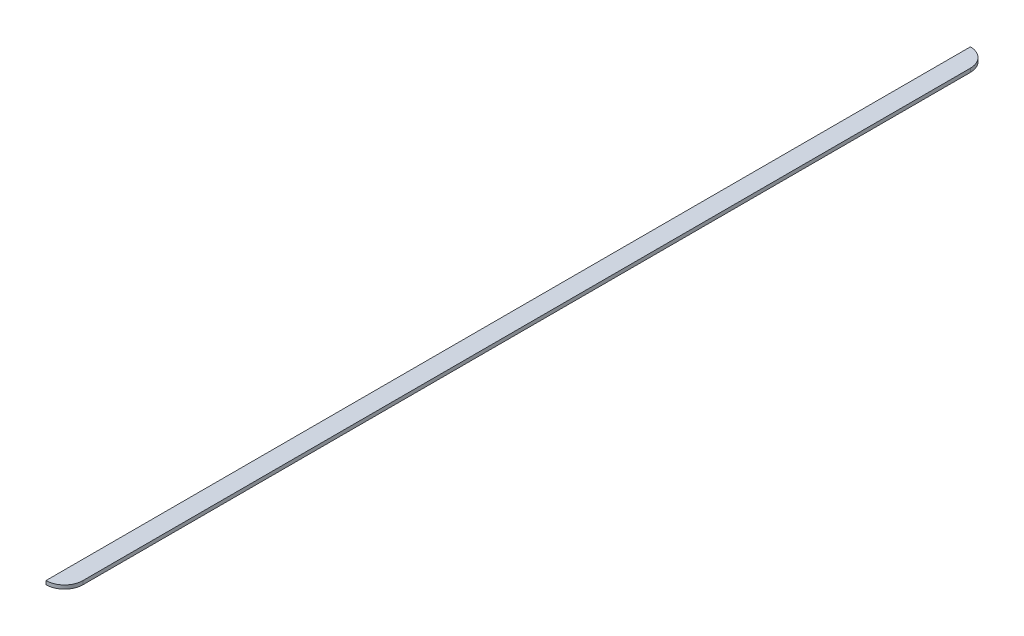
ISO-10303-21;
HEADER;
FILE_DESCRIPTION(('STEP AP214'),'2;1');
FILE_NAME('part.step','',(''),(''),'','','');
FILE_SCHEMA(('AUTOMOTIVE_DESIGN { 1 0 10303 214 1 1 1 1 }'));
ENDSEC;
DATA;
#1=APPLICATION_CONTEXT('core data for automotive mechanical design processes');
#2=APPLICATION_PROTOCOL_DEFINITION('international standard','automotive_design',2000,#1);
#3=PRODUCT_CONTEXT('',#1,'mechanical');
#4=PRODUCT('Part','Part','',(#3));
#5=PRODUCT_RELATED_PRODUCT_CATEGORY('part','',(#4));
#6=PRODUCT_DEFINITION_FORMATION('','',#4);
#7=PRODUCT_DEFINITION_CONTEXT('part definition',#1,'design');
#8=PRODUCT_DEFINITION('design','',#6,#7);
#9=PRODUCT_DEFINITION_SHAPE('','',#8);
#10=(LENGTH_UNIT() NAMED_UNIT(*) SI_UNIT(.MILLI.,.METRE.));
#11=(NAMED_UNIT(*) PLANE_ANGLE_UNIT() SI_UNIT($,.RADIAN.));
#12=(NAMED_UNIT(*) SI_UNIT($,.STERADIAN.) SOLID_ANGLE_UNIT());
#13=UNCERTAINTY_MEASURE_WITH_UNIT(LENGTH_MEASURE(1.E-05),#10,'distance_accuracy_value','');
#14=(GEOMETRIC_REPRESENTATION_CONTEXT(3) GLOBAL_UNCERTAINTY_ASSIGNED_CONTEXT((#13)) GLOBAL_UNIT_ASSIGNED_CONTEXT((#10,
#11,#12)) REPRESENTATION_CONTEXT('',''));
#15=CARTESIAN_POINT('',(0.,0.,0.));
#16=DIRECTION('',(0.,0.,1.));
#17=DIRECTION('',(1.,0.,0.));
#18=AXIS2_PLACEMENT_3D('',#15,#16,#17);
#19=CARTESIAN_POINT('',(0.,0.,250.));
#20=DIRECTION('',(-1.,0.,0.));
#21=DIRECTION('',(0.,-1.,0.));
#22=AXIS2_PLACEMENT_3D('',#19,#20,#21);
#23=PLANE('',#22);
#24=DIRECTION('',(0.,1.,0.));
#25=VECTOR('',#24,1.);
#26=CARTESIAN_POINT('',(0.,0.,-250.));
#27=LINE('',#26,#25);
#28=CARTESIAN_POINT('',(0.,0.,-250.));
#29=VERTEX_POINT('',#28);
#30=CARTESIAN_POINT('',(0.,2.,-250.));
#31=VERTEX_POINT('',#30);
#32=EDGE_CURVE('E96',#29,#31,#27,.T.);
#33=ORIENTED_EDGE('',*,*,#32,.F.);
#34=DIRECTION('',(0.,0.,-1.));
#35=VECTOR('',#34,1.);
#36=CARTESIAN_POINT('',(0.,0.,250.));
#37=LINE('',#36,#35);
#38=CARTESIAN_POINT('',(0.,0.,250.));
#39=VERTEX_POINT('',#38);
#40=EDGE_CURVE('E95',#39,#29,#37,.T.);
#41=ORIENTED_EDGE('',*,*,#40,.F.);
#42=DIRECTION('',(0.,1.,0.));
#43=VECTOR('',#42,1.);
#44=CARTESIAN_POINT('',(0.,0.,250.));
#45=LINE('',#44,#43);
#46=CARTESIAN_POINT('',(0.,2.,250.));
#47=VERTEX_POINT('',#46);
#48=EDGE_CURVE('E80',#39,#47,#45,.T.);
#49=ORIENTED_EDGE('',*,*,#48,.T.);
#50=DIRECTION('',(0.,0.,-1.));
#51=VECTOR('',#50,1.);
#52=CARTESIAN_POINT('',(0.,2.,250.));
#53=LINE('',#52,#51);
#54=EDGE_CURVE('E87',#47,#31,#53,.T.);
#55=ORIENTED_EDGE('',*,*,#54,.T.);
#56=EDGE_LOOP('',(#33,#41,#49,#55));
#57=FACE_BOUND('',#56,.T.);
#58=ADVANCED_FACE('F37',(#57),#23,.T.);
#59=CARTESIAN_POINT('',(0.,0.,250.));
#60=DIRECTION('',(0.,1.,0.));
#61=DIRECTION('',(0.,0.,1.));
#62=AXIS2_PLACEMENT_3D('',#59,#60,#61);
#63=PLANE('',#62);
#64=ORIENTED_EDGE('',*,*,#40,.T.);
#65=CARTESIAN_POINT('',(0.,0.,-240.));
#66=DIRECTION('',(0.,1.,0.));
#67=DIRECTION('',(0.,0.,1.));
#68=AXIS2_PLACEMENT_3D('',#65,#66,#67);
#69=CIRCLE('',#68,10.);
#70=CARTESIAN_POINT('',(10.,0.,-240.));
#71=VERTEX_POINT('',#70);
#72=EDGE_CURVE('E11',#29,#71,#69,.F.);
#73=ORIENTED_EDGE('',*,*,#72,.T.);
#74=DIRECTION('',(0.,0.,-1.));
#75=VECTOR('',#74,1.);
#76=CARTESIAN_POINT('',(10.,0.,250.));
#77=LINE('',#76,#75);
#78=CARTESIAN_POINT('',(10.,0.,240.));
#79=VERTEX_POINT('',#78);
#80=EDGE_CURVE('E101',#79,#71,#77,.T.);
#81=ORIENTED_EDGE('',*,*,#80,.F.);
#82=CARTESIAN_POINT('',(0.,0.,240.));
#83=DIRECTION('',(0.,1.,0.));
#84=DIRECTION('',(0.,0.,1.));
#85=AXIS2_PLACEMENT_3D('',#82,#83,#84);
#86=CIRCLE('',#85,10.);
#87=EDGE_CURVE('E45',#79,#39,#86,.F.);
#88=ORIENTED_EDGE('',*,*,#87,.T.);
#89=EDGE_LOOP('',(#64,#73,#81,#88));
#90=FACE_BOUND('',#89,.T.);
#91=ADVANCED_FACE('F107',(#90),#63,.F.);
#92=CARTESIAN_POINT('',(10.,0.,250.));
#93=DIRECTION('',(-1.,0.,0.));
#94=DIRECTION('',(0.,-1.,0.));
#95=AXIS2_PLACEMENT_3D('',#92,#93,#94);
#96=PLANE('',#95);
#97=ORIENTED_EDGE('',*,*,#80,.T.);
#98=DIRECTION('',(0.,1.,0.));
#99=VECTOR('',#98,1.);
#100=CARTESIAN_POINT('',(10.,2.,-240.));
#101=LINE('',#100,#99);
#102=CARTESIAN_POINT('',(10.,2.,-240.));
#103=VERTEX_POINT('',#102);
#104=EDGE_CURVE('E84',#71,#103,#101,.T.);
#105=ORIENTED_EDGE('',*,*,#104,.T.);
#106=DIRECTION('',(0.,0.,-1.));
#107=VECTOR('',#106,1.);
#108=CARTESIAN_POINT('',(10.,2.,250.));
#109=LINE('',#108,#107);
#110=CARTESIAN_POINT('',(10.,2.,240.));
#111=VERTEX_POINT('',#110);
#112=EDGE_CURVE('E92',#111,#103,#109,.T.);
#113=ORIENTED_EDGE('',*,*,#112,.F.);
#114=DIRECTION('',(0.,1.,0.));
#115=VECTOR('',#114,1.);
#116=CARTESIAN_POINT('',(10.,0.,240.));
#117=LINE('',#116,#115);
#118=EDGE_CURVE('E57',#111,#79,#117,.F.);
#119=ORIENTED_EDGE('',*,*,#118,.T.);
#120=EDGE_LOOP('',(#97,#105,#113,#119));
#121=FACE_BOUND('',#120,.T.);
#122=ADVANCED_FACE('F109',(#121),#96,.F.);
#123=CARTESIAN_POINT('',(0.,2.,250.));
#124=DIRECTION('',(0.,1.,0.));
#125=DIRECTION('',(0.,0.,1.));
#126=AXIS2_PLACEMENT_3D('',#123,#124,#125);
#127=PLANE('',#126);
#128=ORIENTED_EDGE('',*,*,#112,.T.);
#129=CARTESIAN_POINT('',(0.,2.,-240.));
#130=DIRECTION('',(0.,1.,0.));
#131=DIRECTION('',(0.,0.,1.));
#132=AXIS2_PLACEMENT_3D('',#129,#130,#131);
#133=CIRCLE('',#132,10.);
#134=EDGE_CURVE('E83',#103,#31,#133,.T.);
#135=ORIENTED_EDGE('',*,*,#134,.T.);
#136=ORIENTED_EDGE('',*,*,#54,.F.);
#137=CARTESIAN_POINT('',(0.,2.,240.));
#138=DIRECTION('',(0.,1.,0.));
#139=DIRECTION('',(0.,0.,1.));
#140=AXIS2_PLACEMENT_3D('',#137,#138,#139);
#141=CIRCLE('',#140,10.);
#142=EDGE_CURVE('E76',#47,#111,#141,.T.);
#143=ORIENTED_EDGE('',*,*,#142,.T.);
#144=EDGE_LOOP('',(#128,#135,#136,#143));
#145=FACE_BOUND('',#144,.T.);
#146=ADVANCED_FACE('F88',(#145),#127,.T.);
#147=CARTESIAN_POINT('',(0.,0.,-240.));
#148=DIRECTION('',(0.,-1.,0.));
#149=DIRECTION('',(1.,0.,0.));
#150=AXIS2_PLACEMENT_3D('',#147,#148,#149);
#151=CYLINDRICAL_SURFACE('',#150,10.);
#152=ORIENTED_EDGE('',*,*,#72,.F.);
#153=ORIENTED_EDGE('',*,*,#32,.T.);
#154=ORIENTED_EDGE('',*,*,#134,.F.);
#155=ORIENTED_EDGE('',*,*,#104,.F.);
#156=EDGE_LOOP('',(#152,#153,#154,#155));
#157=FACE_BOUND('',#156,.T.);
#158=ADVANCED_FACE('F111',(#157),#151,.T.);
#159=CARTESIAN_POINT('',(0.,0.,240.));
#160=DIRECTION('',(0.,1.,0.));
#161=DIRECTION('',(-1.,0.,0.));
#162=AXIS2_PLACEMENT_3D('',#159,#160,#161);
#163=CYLINDRICAL_SURFACE('',#162,10.);
#164=ORIENTED_EDGE('',*,*,#87,.F.);
#165=ORIENTED_EDGE('',*,*,#118,.F.);
#166=ORIENTED_EDGE('',*,*,#142,.F.);
#167=ORIENTED_EDGE('',*,*,#48,.F.);
#168=EDGE_LOOP('',(#164,#165,#166,#167));
#169=FACE_BOUND('',#168,.T.);
#170=ADVANCED_FACE('F39',(#169),#163,.T.);
#171=CLOSED_SHELL('',(#58,#91,#122,#146,#158,#170));
#172=MANIFOLD_SOLID_BREP('B2',#171);
#173=ADVANCED_BREP_SHAPE_REPRESENTATION('',(#18,#172),#14);
#174=SHAPE_DEFINITION_REPRESENTATION(#9,#173);
ENDSEC;
END-ISO-10303-21;
